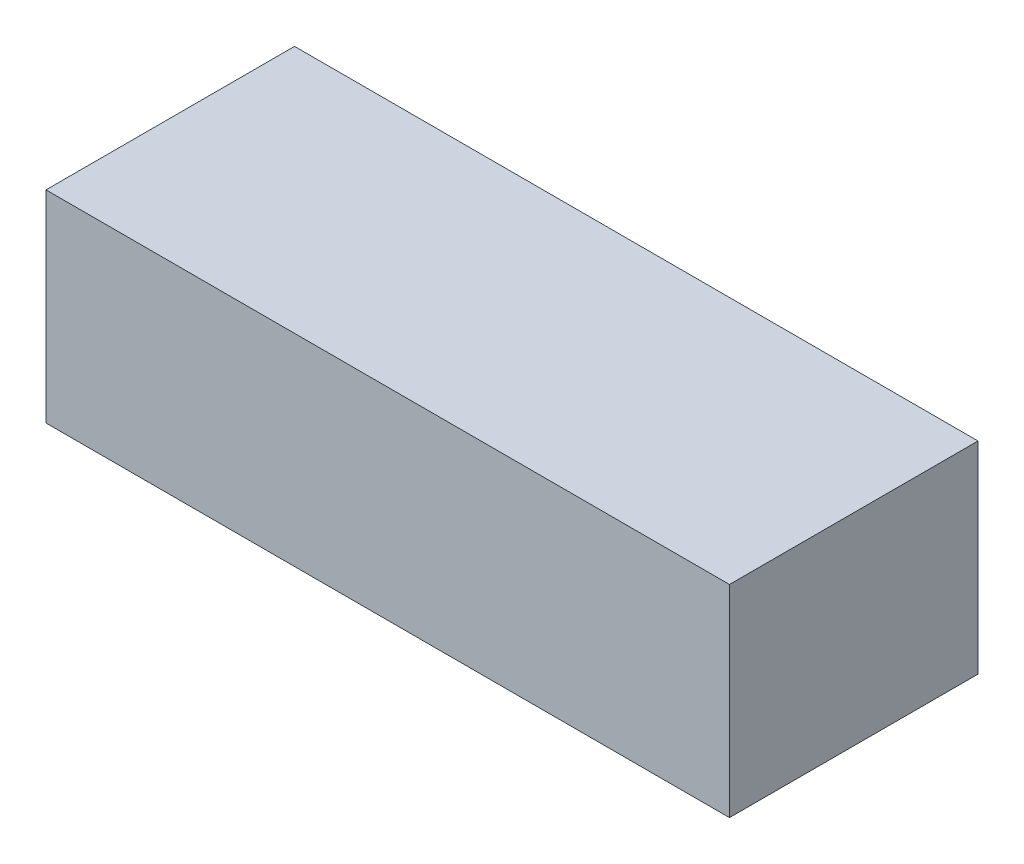
ISO-10303-21;
HEADER;
FILE_DESCRIPTION(('STEP AP214'),'2;1');
FILE_NAME('part.step','',(''),(''),'','','');
FILE_SCHEMA(('AUTOMOTIVE_DESIGN { 1 0 10303 214 1 1 1 1 }'));
ENDSEC;
DATA;
#1=APPLICATION_CONTEXT('core data for automotive mechanical design processes');
#2=APPLICATION_PROTOCOL_DEFINITION('international standard','automotive_design',2000,#1);
#3=PRODUCT_CONTEXT('',#1,'mechanical');
#4=PRODUCT('Part','Part','',(#3));
#5=PRODUCT_RELATED_PRODUCT_CATEGORY('part','',(#4));
#6=PRODUCT_DEFINITION_FORMATION('','',#4);
#7=PRODUCT_DEFINITION_CONTEXT('part definition',#1,'design');
#8=PRODUCT_DEFINITION('design','',#6,#7);
#9=PRODUCT_DEFINITION_SHAPE('','',#8);
#10=(LENGTH_UNIT() NAMED_UNIT(*) SI_UNIT(.MILLI.,.METRE.));
#11=(NAMED_UNIT(*) PLANE_ANGLE_UNIT() SI_UNIT($,.RADIAN.));
#12=(NAMED_UNIT(*) SI_UNIT($,.STERADIAN.) SOLID_ANGLE_UNIT());
#13=UNCERTAINTY_MEASURE_WITH_UNIT(LENGTH_MEASURE(1.E-05),#10,'distance_accuracy_value','');
#14=(GEOMETRIC_REPRESENTATION_CONTEXT(3) GLOBAL_UNCERTAINTY_ASSIGNED_CONTEXT((#13)) GLOBAL_UNIT_ASSIGNED_CONTEXT((#10,
#11,#12)) REPRESENTATION_CONTEXT('',''));
#15=CARTESIAN_POINT('',(0.,0.,0.));
#16=DIRECTION('',(0.,0.,1.));
#17=DIRECTION('',(1.,0.,0.));
#18=AXIS2_PLACEMENT_3D('',#15,#16,#17);
#19=CARTESIAN_POINT('',(20.,-12.,6.));
#20=DIRECTION('',(-1.,0.,0.));
#21=DIRECTION('',(0.,0.,1.));
#22=AXIS2_PLACEMENT_3D('',#19,#20,#21);
#23=PLANE('',#22);
#24=DIRECTION('',(0.,1.,0.));
#25=VECTOR('',#24,1.);
#26=CARTESIAN_POINT('',(20.,-12.,-6.));
#27=LINE('',#26,#25);
#28=CARTESIAN_POINT('',(20.,-7.,-6.));
#29=VERTEX_POINT('',#28);
#30=CARTESIAN_POINT('',(20.,-2.,-6.));
#31=VERTEX_POINT('',#30);
#32=EDGE_CURVE('E231',#29,#31,#27,.T.);
#33=ORIENTED_EDGE('',*,*,#32,.F.);
#34=DIRECTION('',(0.,0.,-1.));
#35=VECTOR('',#34,1.);
#36=CARTESIAN_POINT('',(20.,-7.,6.));
#37=LINE('',#36,#35);
#38=CARTESIAN_POINT('',(20.,-7.,6.));
#39=VERTEX_POINT('',#38);
#40=EDGE_CURVE('E238',#39,#29,#37,.T.);
#41=ORIENTED_EDGE('',*,*,#40,.F.);
#42=DIRECTION('',(0.,1.,0.));
#43=VECTOR('',#42,1.);
#44=CARTESIAN_POINT('',(20.,-12.,6.));
#45=LINE('',#44,#43);
#46=CARTESIAN_POINT('',(20.,-2.,6.));
#47=VERTEX_POINT('',#46);
#48=EDGE_CURVE('E251',#39,#47,#45,.T.);
#49=ORIENTED_EDGE('',*,*,#48,.T.);
#50=DIRECTION('',(0.,0.,1.));
#51=VECTOR('',#50,1.);
#52=CARTESIAN_POINT('',(20.,-2.,6.));
#53=LINE('',#52,#51);
#54=EDGE_CURVE('E249',#31,#47,#53,.T.);
#55=ORIENTED_EDGE('',*,*,#54,.F.);
#56=EDGE_LOOP('',(#33,#41,#49,#55));
#57=FACE_BOUND('',#56,.T.);
#58=ADVANCED_FACE('F39',(#57),#23,.T.);
#59=CARTESIAN_POINT('',(0.,-12.,0.));
#60=DIRECTION('',(0.,-1.,0.));
#61=DIRECTION('',(0.,0.,-1.));
#62=AXIS2_PLACEMENT_3D('',#59,#60,#61);
#63=PLANE('',#62);
#64=DIRECTION('',(-1.,0.,0.));
#65=VECTOR('',#64,1.);
#66=CARTESIAN_POINT('',(-20.,-12.,6.));
#67=LINE('',#66,#65);
#68=CARTESIAN_POINT('',(21.,-12.,6.));
#69=VERTEX_POINT('',#68);
#70=CARTESIAN_POINT('',(-20.,-12.,6.));
#71=VERTEX_POINT('',#70);
#72=EDGE_CURVE('E417',#69,#71,#67,.T.);
#73=ORIENTED_EDGE('',*,*,#72,.F.);
#74=DIRECTION('',(0.,0.,1.));
#75=VECTOR('',#74,1.);
#76=CARTESIAN_POINT('',(21.,-12.,-7.));
#77=LINE('',#76,#75);
#78=CARTESIAN_POINT('',(21.,-12.,7.));
#79=VERTEX_POINT('',#78);
#80=EDGE_CURVE('E446',#69,#79,#77,.T.);
#81=ORIENTED_EDGE('',*,*,#80,.T.);
#82=DIRECTION('',(-1.,0.,0.));
#83=VECTOR('',#82,1.);
#84=CARTESIAN_POINT('',(21.,-12.,7.));
#85=LINE('',#84,#83);
#86=CARTESIAN_POINT('',(-21.,-12.,7.));
#87=VERTEX_POINT('',#86);
#88=EDGE_CURVE('E445',#79,#87,#85,.T.);
#89=ORIENTED_EDGE('',*,*,#88,.T.);
#90=DIRECTION('',(0.,0.,-1.));
#91=VECTOR('',#90,1.);
#92=CARTESIAN_POINT('',(-21.,-12.,-7.));
#93=LINE('',#92,#91);
#94=CARTESIAN_POINT('',(-21.,-12.,-7.));
#95=VERTEX_POINT('',#94);
#96=EDGE_CURVE('E473',#87,#95,#93,.T.);
#97=ORIENTED_EDGE('',*,*,#96,.T.);
#98=DIRECTION('',(1.,0.,0.));
#99=VECTOR('',#98,1.);
#100=CARTESIAN_POINT('',(21.,-12.,-7.));
#101=LINE('',#100,#99);
#102=CARTESIAN_POINT('',(21.,-12.,-7.));
#103=VERTEX_POINT('',#102);
#104=EDGE_CURVE('E442',#95,#103,#101,.T.);
#105=ORIENTED_EDGE('',*,*,#104,.T.);
#106=CARTESIAN_POINT('',(21.,-12.,-6.));
#107=VERTEX_POINT('',#106);
#108=EDGE_CURVE('E440',#103,#107,#77,.T.);
#109=ORIENTED_EDGE('',*,*,#108,.T.);
#110=DIRECTION('',(1.,0.,0.));
#111=VECTOR('',#110,1.);
#112=CARTESIAN_POINT('',(-20.,-12.,-6.));
#113=LINE('',#112,#111);
#114=CARTESIAN_POINT('',(-20.,-12.,-6.));
#115=VERTEX_POINT('',#114);
#116=EDGE_CURVE('E56',#115,#107,#113,.T.);
#117=ORIENTED_EDGE('',*,*,#116,.F.);
#118=DIRECTION('',(0.,0.,-1.));
#119=VECTOR('',#118,1.);
#120=CARTESIAN_POINT('',(-20.,-12.,6.));
#121=LINE('',#120,#119);
#122=EDGE_CURVE('E413',#71,#115,#121,.T.);
#123=ORIENTED_EDGE('',*,*,#122,.F.);
#124=EDGE_LOOP('',(#73,#81,#89,#97,#105,#109,#117,#123));
#125=FACE_BOUND('',#124,.T.);
#126=ADVANCED_FACE('F436',(#125),#63,.T.);
#127=CARTESIAN_POINT('',(0.,-2.,0.));
#128=DIRECTION('',(0.,-1.,0.));
#129=DIRECTION('',(0.,0.,-1.));
#130=AXIS2_PLACEMENT_3D('',#127,#128,#129);
#131=PLANE('',#130);
#132=DIRECTION('',(1.,0.,0.));
#133=VECTOR('',#132,1.);
#134=CARTESIAN_POINT('',(-20.,-2.,-6.));
#135=LINE('',#134,#133);
#136=CARTESIAN_POINT('',(-18.3,-2.,-6.));
#137=VERTEX_POINT('',#136);
#138=CARTESIAN_POINT('',(-6.85,-2.,-6.00000000000006));
#139=VERTEX_POINT('',#138);
#140=EDGE_CURVE('E419',#137,#139,#135,.T.);
#141=ORIENTED_EDGE('',*,*,#140,.T.);
#142=DIRECTION('',(0.,0.,-1.));
#143=VECTOR('',#142,1.);
#144=CARTESIAN_POINT('',(-6.85,-2.,6.));
#145=LINE('',#144,#143);
#146=CARTESIAN_POINT('',(-6.85,-2.,6.));
#147=VERTEX_POINT('',#146);
#148=EDGE_CURVE('E320',#147,#139,#145,.T.);
#149=ORIENTED_EDGE('',*,*,#148,.F.);
#150=DIRECTION('',(-1.,0.,0.));
#151=VECTOR('',#150,1.);
#152=CARTESIAN_POINT('',(-20.,-2.,6.));
#153=LINE('',#152,#151);
#154=CARTESIAN_POINT('',(-18.3,-2.,6.));
#155=VERTEX_POINT('',#154);
#156=EDGE_CURVE('E424',#147,#155,#153,.T.);
#157=ORIENTED_EDGE('',*,*,#156,.T.);
#158=DIRECTION('',(0.,0.,-1.));
#159=VECTOR('',#158,1.);
#160=CARTESIAN_POINT('',(-18.3,-2.,6.));
#161=LINE('',#160,#159);
#162=EDGE_CURVE('E340',#155,#137,#161,.T.);
#163=ORIENTED_EDGE('',*,*,#162,.T.);
#164=EDGE_LOOP('',(#141,#149,#157,#163));
#165=FACE_BOUND('',#164,.T.);
#166=ADVANCED_FACE('F502',(#165),#131,.T.);
#167=CARTESIAN_POINT('',(-20.,-12.,6.));
#168=DIRECTION('',(1.,0.,0.));
#169=DIRECTION('',(0.,0.,-1.));
#170=AXIS2_PLACEMENT_3D('',#167,#168,#169);
#171=PLANE('',#170);
#172=DIRECTION('',(0.,0.,1.));
#173=VECTOR('',#172,1.);
#174=CARTESIAN_POINT('',(-20.,-11.,0.));
#175=LINE('',#174,#173);
#176=CARTESIAN_POINT('',(-20.,-11.,-5.49999999999999));
#177=VERTEX_POINT('',#176);
#178=CARTESIAN_POINT('',(-20.,-11.,5.50000000000001));
#179=VERTEX_POINT('',#178);
#180=EDGE_CURVE('E390',#177,#179,#175,.T.);
#181=ORIENTED_EDGE('',*,*,#180,.T.);
#182=DIRECTION('',(0.,-1.,0.));
#183=VECTOR('',#182,1.);
#184=CARTESIAN_POINT('',(-20.,0.,5.5));
#185=LINE('',#184,#183);
#186=CARTESIAN_POINT('',(-20.,-7.,5.50000000000001));
#187=VERTEX_POINT('',#186);
#188=EDGE_CURVE('E382',#187,#179,#185,.T.);
#189=ORIENTED_EDGE('',*,*,#188,.F.);
#190=DIRECTION('',(0.,0.,1.));
#191=VECTOR('',#190,1.);
#192=CARTESIAN_POINT('',(-20.,-7.,0.));
#193=LINE('',#192,#191);
#194=CARTESIAN_POINT('',(-20.,-7.,-5.5));
#195=VERTEX_POINT('',#194);
#196=EDGE_CURVE('E384',#195,#187,#193,.T.);
#197=ORIENTED_EDGE('',*,*,#196,.F.);
#198=DIRECTION('',(0.,-1.,0.));
#199=VECTOR('',#198,1.);
#200=CARTESIAN_POINT('',(-20.,0.,-5.5));
#201=LINE('',#200,#199);
#202=EDGE_CURVE('E387',#195,#177,#201,.T.);
#203=ORIENTED_EDGE('',*,*,#202,.T.);
#204=EDGE_LOOP('',(#181,#189,#197,#203));
#205=FACE_BOUND('',#204,.T.);
#206=DIRECTION('',(0.,1.,0.));
#207=VECTOR('',#206,1.);
#208=CARTESIAN_POINT('',(-20.,-12.,-6.));
#209=LINE('',#208,#207);
#210=CARTESIAN_POINT('',(-20.,-6.6,-6.));
#211=VERTEX_POINT('',#210);
#212=EDGE_CURVE('E250',#115,#211,#209,.T.);
#213=ORIENTED_EDGE('',*,*,#212,.T.);
#214=DIRECTION('',(0.,0.,-1.));
#215=VECTOR('',#214,1.);
#216=CARTESIAN_POINT('',(-20.,-6.6,6.));
#217=LINE('',#216,#215);
#218=CARTESIAN_POINT('',(-20.,-6.6,6.));
#219=VERTEX_POINT('',#218);
#220=EDGE_CURVE('E339',#219,#211,#217,.T.);
#221=ORIENTED_EDGE('',*,*,#220,.F.);
#222=DIRECTION('',(0.,1.,0.));
#223=VECTOR('',#222,1.);
#224=CARTESIAN_POINT('',(-20.,-12.,6.));
#225=LINE('',#224,#223);
#226=EDGE_CURVE('E256',#71,#219,#225,.T.);
#227=ORIENTED_EDGE('',*,*,#226,.F.);
#228=ORIENTED_EDGE('',*,*,#122,.T.);
#229=EDGE_LOOP('',(#213,#221,#227,#228));
#230=FACE_BOUND('',#229,.T.);
#231=ADVANCED_FACE('F434',(#205,#230),#171,.T.);
#232=CARTESIAN_POINT('',(-20.,-12.,-6.));
#233=DIRECTION('',(0.,0.,1.));
#234=DIRECTION('',(1.,0.,0.));
#235=AXIS2_PLACEMENT_3D('',#232,#233,#234);
#236=PLANE('',#235);
#237=DIRECTION('',(0.,1.,0.));
#238=VECTOR('',#237,1.);
#239=CARTESIAN_POINT('',(-5.15,-6.6,-6.00000000000005));
#240=LINE('',#239,#238);
#241=CARTESIAN_POINT('',(-5.15,-6.6,-6.00000000000005));
#242=VERTEX_POINT('',#241);
#243=CARTESIAN_POINT('',(-5.15,-2.,-6.00000000000005));
#244=VERTEX_POINT('',#243);
#245=EDGE_CURVE('E310',#242,#244,#240,.T.);
#246=ORIENTED_EDGE('',*,*,#245,.F.);
#247=DIRECTION('',(-1.,0.,0.));
#248=VECTOR('',#247,1.);
#249=CARTESIAN_POINT('',(-5.15,-6.6,-6.00000000000005));
#250=LINE('',#249,#248);
#251=CARTESIAN_POINT('',(-6.85,-6.6,-6.00000000000006));
#252=VERTEX_POINT('',#251);
#253=EDGE_CURVE('E330',#242,#252,#250,.T.);
#254=ORIENTED_EDGE('',*,*,#253,.T.);
#255=DIRECTION('',(0.,1.,0.));
#256=VECTOR('',#255,1.);
#257=CARTESIAN_POINT('',(-6.85,-6.6,-6.00000000000006));
#258=LINE('',#257,#256);
#259=EDGE_CURVE('E313',#252,#139,#258,.T.);
#260=ORIENTED_EDGE('',*,*,#259,.T.);
#261=ORIENTED_EDGE('',*,*,#140,.F.);
#262=DIRECTION('',(0.,1.,0.));
#263=VECTOR('',#262,1.);
#264=CARTESIAN_POINT('',(-18.3,-6.6,-6.));
#265=LINE('',#264,#263);
#266=CARTESIAN_POINT('',(-18.3,-6.6,-6.));
#267=VERTEX_POINT('',#266);
#268=EDGE_CURVE('E326',#267,#137,#265,.T.);
#269=ORIENTED_EDGE('',*,*,#268,.F.);
#270=DIRECTION('',(1.,0.,0.));
#271=VECTOR('',#270,1.);
#272=CARTESIAN_POINT('',(-20.,-6.6,-6.));
#273=LINE('',#272,#271);
#274=EDGE_CURVE('E344',#211,#267,#273,.T.);
#275=ORIENTED_EDGE('',*,*,#274,.F.);
#276=ORIENTED_EDGE('',*,*,#212,.F.);
#277=ORIENTED_EDGE('',*,*,#116,.T.);
#278=DIRECTION('',(0.,-1.,0.));
#279=VECTOR('',#278,1.);
#280=CARTESIAN_POINT('',(21.,-7.,-6.));
#281=LINE('',#280,#279);
#282=CARTESIAN_POINT('',(21.,-7.,-6.));
#283=VERTEX_POINT('',#282);
#284=EDGE_CURVE('E233',#283,#107,#281,.T.);
#285=ORIENTED_EDGE('',*,*,#284,.F.);
#286=DIRECTION('',(1.,0.,0.));
#287=VECTOR('',#286,1.);
#288=CARTESIAN_POINT('',(20.,-7.,-6.));
#289=LINE('',#288,#287);
#290=EDGE_CURVE('E225',#29,#283,#289,.T.);
#291=ORIENTED_EDGE('',*,*,#290,.F.);
#292=ORIENTED_EDGE('',*,*,#32,.T.);
#293=CARTESIAN_POINT('',(8.,-2.,-6.));
#294=VERTEX_POINT('',#293);
#295=EDGE_CURVE('E406',#294,#31,#135,.T.);
#296=ORIENTED_EDGE('',*,*,#295,.F.);
#297=DIRECTION('',(0.,1.,0.));
#298=VECTOR('',#297,1.);
#299=CARTESIAN_POINT('',(8.,-6.6,-6.));
#300=LINE('',#299,#298);
#301=CARTESIAN_POINT('',(8.,-6.6,-6.));
#302=VERTEX_POINT('',#301);
#303=EDGE_CURVE('E372',#302,#294,#300,.T.);
#304=ORIENTED_EDGE('',*,*,#303,.F.);
#305=DIRECTION('',(1.,0.,0.));
#306=VECTOR('',#305,1.);
#307=CARTESIAN_POINT('',(0.,-6.6,-6.));
#308=LINE('',#307,#306);
#309=CARTESIAN_POINT('',(6.3,-6.6,-6.));
#310=VERTEX_POINT('',#309);
#311=EDGE_CURVE('E360',#310,#302,#308,.T.);
#312=ORIENTED_EDGE('',*,*,#311,.F.);
#313=DIRECTION('',(0.,1.,0.));
#314=VECTOR('',#313,1.);
#315=CARTESIAN_POINT('',(6.3,-6.6,-6.));
#316=LINE('',#315,#314);
#317=CARTESIAN_POINT('',(6.3,-2.,-6.));
#318=VERTEX_POINT('',#317);
#319=EDGE_CURVE('E375',#310,#318,#316,.T.);
#320=ORIENTED_EDGE('',*,*,#319,.T.);
#321=EDGE_CURVE('E422',#244,#318,#135,.T.);
#322=ORIENTED_EDGE('',*,*,#321,.F.);
#323=EDGE_LOOP('',(#246,#254,#260,#261,#269,#275,#276,#277,#285,#291,#292,#296,#304,#312,#320,#322));
#324=FACE_BOUND('',#323,.T.);
#325=ADVANCED_FACE('F228',(#324),#236,.T.);
#326=CARTESIAN_POINT('',(-20.,-12.,6.));
#327=DIRECTION('',(0.,0.,-1.));
#328=DIRECTION('',(-1.,0.,0.));
#329=AXIS2_PLACEMENT_3D('',#326,#327,#328);
#330=PLANE('',#329);
#331=DIRECTION('',(0.,1.,0.));
#332=VECTOR('',#331,1.);
#333=CARTESIAN_POINT('',(-5.15,-6.6,6.));
#334=LINE('',#333,#332);
#335=CARTESIAN_POINT('',(-5.15,-6.6,6.));
#336=VERTEX_POINT('',#335);
#337=CARTESIAN_POINT('',(-5.15,-2.,6.));
#338=VERTEX_POINT('',#337);
#339=EDGE_CURVE('E309',#336,#338,#334,.T.);
#340=ORIENTED_EDGE('',*,*,#339,.T.);
#341=CARTESIAN_POINT('',(6.3,-2.,6.));
#342=VERTEX_POINT('',#341);
#343=EDGE_CURVE('E425',#342,#338,#153,.T.);
#344=ORIENTED_EDGE('',*,*,#343,.F.);
#345=DIRECTION('',(0.,1.,0.));
#346=VECTOR('',#345,1.);
#347=CARTESIAN_POINT('',(6.3,-6.6,6.));
#348=LINE('',#347,#346);
#349=CARTESIAN_POINT('',(6.3,-6.6,6.));
#350=VERTEX_POINT('',#349);
#351=EDGE_CURVE('E378',#350,#342,#348,.T.);
#352=ORIENTED_EDGE('',*,*,#351,.F.);
#353=DIRECTION('',(-1.,0.,0.));
#354=VECTOR('',#353,1.);
#355=CARTESIAN_POINT('',(0.,-6.6,6.));
#356=LINE('',#355,#354);
#357=CARTESIAN_POINT('',(8.,-6.6,6.));
#358=VERTEX_POINT('',#357);
#359=EDGE_CURVE('E353',#358,#350,#356,.T.);
#360=ORIENTED_EDGE('',*,*,#359,.F.);
#361=DIRECTION('',(0.,1.,0.));
#362=VECTOR('',#361,1.);
#363=CARTESIAN_POINT('',(8.,-6.6,6.));
#364=LINE('',#363,#362);
#365=CARTESIAN_POINT('',(8.,-2.,6.));
#366=VERTEX_POINT('',#365);
#367=EDGE_CURVE('E366',#358,#366,#364,.T.);
#368=ORIENTED_EDGE('',*,*,#367,.T.);
#369=EDGE_CURVE('E415',#47,#366,#153,.T.);
#370=ORIENTED_EDGE('',*,*,#369,.F.);
#371=ORIENTED_EDGE('',*,*,#48,.F.);
#372=DIRECTION('',(-1.,0.,0.));
#373=VECTOR('',#372,1.);
#374=CARTESIAN_POINT('',(20.,-7.,6.));
#375=LINE('',#374,#373);
#376=CARTESIAN_POINT('',(21.,-7.,6.));
#377=VERTEX_POINT('',#376);
#378=EDGE_CURVE('E243',#377,#39,#375,.T.);
#379=ORIENTED_EDGE('',*,*,#378,.F.);
#380=DIRECTION('',(0.,-1.,0.));
#381=VECTOR('',#380,1.);
#382=CARTESIAN_POINT('',(21.,-7.,6.));
#383=LINE('',#382,#381);
#384=EDGE_CURVE('E474',#377,#69,#383,.T.);
#385=ORIENTED_EDGE('',*,*,#384,.T.);
#386=ORIENTED_EDGE('',*,*,#72,.T.);
#387=ORIENTED_EDGE('',*,*,#226,.T.);
#388=DIRECTION('',(1.,0.,0.));
#389=VECTOR('',#388,1.);
#390=CARTESIAN_POINT('',(-20.,-6.6,6.));
#391=LINE('',#390,#389);
#392=CARTESIAN_POINT('',(-18.3,-6.6,6.));
#393=VERTEX_POINT('',#392);
#394=EDGE_CURVE('E346',#219,#393,#391,.T.);
#395=ORIENTED_EDGE('',*,*,#394,.T.);
#396=DIRECTION('',(0.,1.,0.));
#397=VECTOR('',#396,1.);
#398=CARTESIAN_POINT('',(-18.3,-6.6,6.));
#399=LINE('',#398,#397);
#400=EDGE_CURVE('E336',#393,#155,#399,.T.);
#401=ORIENTED_EDGE('',*,*,#400,.T.);
#402=ORIENTED_EDGE('',*,*,#156,.F.);
#403=DIRECTION('',(0.,1.,0.));
#404=VECTOR('',#403,1.);
#405=CARTESIAN_POINT('',(-6.85,-6.6,6.));
#406=LINE('',#405,#404);
#407=CARTESIAN_POINT('',(-6.85,-6.6,6.));
#408=VERTEX_POINT('',#407);
#409=EDGE_CURVE('E316',#408,#147,#406,.T.);
#410=ORIENTED_EDGE('',*,*,#409,.F.);
#411=DIRECTION('',(-1.,0.,0.));
#412=VECTOR('',#411,1.);
#413=CARTESIAN_POINT('',(-5.15,-6.6,6.));
#414=LINE('',#413,#412);
#415=EDGE_CURVE('E312',#336,#408,#414,.T.);
#416=ORIENTED_EDGE('',*,*,#415,.F.);
#417=EDGE_LOOP('',(#340,#344,#352,#360,#368,#370,#371,#379,#385,#386,#387,#395,#401,#402,#410,#416));
#418=FACE_BOUND('',#417,.T.);
#419=ADVANCED_FACE('F429',(#418),#330,.T.);
#420=DIRECTION('',(0.,0.,-1.));
#421=VECTOR('',#420,1.);
#422=CARTESIAN_POINT('',(-5.15,-2.,6.));
#423=LINE('',#422,#421);
#424=EDGE_CURVE('E322',#338,#244,#423,.T.);
#425=ORIENTED_EDGE('',*,*,#424,.T.);
#426=ORIENTED_EDGE('',*,*,#321,.T.);
#427=DIRECTION('',(0.,0.,-1.));
#428=VECTOR('',#427,1.);
#429=CARTESIAN_POINT('',(6.3,-2.,0.));
#430=LINE('',#429,#428);
#431=EDGE_CURVE('E343',#342,#318,#430,.T.);
#432=ORIENTED_EDGE('',*,*,#431,.F.);
#433=ORIENTED_EDGE('',*,*,#343,.T.);
#434=EDGE_LOOP('',(#425,#426,#432,#433));
#435=FACE_BOUND('',#434,.T.);
#436=ADVANCED_FACE('F489',(#435),#131,.T.);
#437=CARTESIAN_POINT('',(-22.,-2.,-8.));
#438=DIRECTION('',(-1.,0.,0.));
#439=DIRECTION('',(0.,0.,1.));
#440=AXIS2_PLACEMENT_3D('',#437,#438,#439);
#441=PLANE('',#440);
#442=DIRECTION('',(0.,0.,1.));
#443=VECTOR('',#442,1.);
#444=CARTESIAN_POINT('',(-22.,0.,-8.));
#445=LINE('',#444,#443);
#446=CARTESIAN_POINT('',(-22.,0.,-8.));
#447=VERTEX_POINT('',#446);
#448=CARTESIAN_POINT('',(-22.,0.,8.));
#449=VERTEX_POINT('',#448);
#450=EDGE_CURVE('E267',#447,#449,#445,.T.);
#451=ORIENTED_EDGE('',*,*,#450,.F.);
#452=DIRECTION('',(0.,1.,0.));
#453=VECTOR('',#452,1.);
#454=CARTESIAN_POINT('',(-22.,-2.,-8.));
#455=LINE('',#454,#453);
#456=CARTESIAN_POINT('',(-22.,-13.,-8.));
#457=VERTEX_POINT('',#456);
#458=EDGE_CURVE('E48',#457,#447,#455,.T.);
#459=ORIENTED_EDGE('',*,*,#458,.F.);
#460=DIRECTION('',(0.,0.,-1.));
#461=VECTOR('',#460,1.);
#462=CARTESIAN_POINT('',(-22.,-13.,8.));
#463=LINE('',#462,#461);
#464=CARTESIAN_POINT('',(-22.,-13.,8.));
#465=VERTEX_POINT('',#464);
#466=EDGE_CURVE('E291',#465,#457,#463,.T.);
#467=ORIENTED_EDGE('',*,*,#466,.F.);
#468=DIRECTION('',(0.,1.,0.));
#469=VECTOR('',#468,1.);
#470=CARTESIAN_POINT('',(-22.,-2.,8.));
#471=LINE('',#470,#469);
#472=EDGE_CURVE('E11',#465,#449,#471,.T.);
#473=ORIENTED_EDGE('',*,*,#472,.T.);
#474=EDGE_LOOP('',(#451,#459,#467,#473));
#475=FACE_BOUND('',#474,.T.);
#476=DIRECTION('',(0.,0.,1.));
#477=VECTOR('',#476,1.);
#478=CARTESIAN_POINT('',(-22.,-7.,0.));
#479=LINE('',#478,#477);
#480=CARTESIAN_POINT('',(-22.,-7.,-5.5));
#481=VERTEX_POINT('',#480);
#482=CARTESIAN_POINT('',(-22.,-7.,5.50000000000001));
#483=VERTEX_POINT('',#482);
#484=EDGE_CURVE('E396',#481,#483,#479,.T.);
#485=ORIENTED_EDGE('',*,*,#484,.T.);
#486=DIRECTION('',(0.,-1.,0.));
#487=VECTOR('',#486,1.);
#488=CARTESIAN_POINT('',(-22.,0.,5.5));
#489=LINE('',#488,#487);
#490=CARTESIAN_POINT('',(-22.,-11.,5.50000000000001));
#491=VERTEX_POINT('',#490);
#492=EDGE_CURVE('E381',#483,#491,#489,.T.);
#493=ORIENTED_EDGE('',*,*,#492,.T.);
#494=DIRECTION('',(0.,0.,1.));
#495=VECTOR('',#494,1.);
#496=CARTESIAN_POINT('',(-22.,-11.,0.));
#497=LINE('',#496,#495);
#498=CARTESIAN_POINT('',(-22.,-11.,-5.49999999999999));
#499=VERTEX_POINT('',#498);
#500=EDGE_CURVE('E385',#499,#491,#497,.T.);
#501=ORIENTED_EDGE('',*,*,#500,.F.);
#502=DIRECTION('',(0.,-1.,0.));
#503=VECTOR('',#502,1.);
#504=CARTESIAN_POINT('',(-22.,0.,-5.5));
#505=LINE('',#504,#503);
#506=EDGE_CURVE('E399',#481,#499,#505,.T.);
#507=ORIENTED_EDGE('',*,*,#506,.F.);
#508=EDGE_LOOP('',(#485,#493,#501,#507));
#509=FACE_BOUND('',#508,.T.);
#510=ADVANCED_FACE('F287',(#475,#509),#441,.T.);
#511=CARTESIAN_POINT('',(-22.,-2.,8.));
#512=DIRECTION('',(0.,0.,1.));
#513=DIRECTION('',(1.,0.,0.));
#514=AXIS2_PLACEMENT_3D('',#511,#512,#513);
#515=PLANE('',#514);
#516=DIRECTION('',(1.,0.,0.));
#517=VECTOR('',#516,1.);
#518=CARTESIAN_POINT('',(-22.,0.,8.));
#519=LINE('',#518,#517);
#520=CARTESIAN_POINT('',(22.,0.,8.));
#521=VERTEX_POINT('',#520);
#522=EDGE_CURVE('E254',#449,#521,#519,.T.);
#523=ORIENTED_EDGE('',*,*,#522,.F.);
#524=ORIENTED_EDGE('',*,*,#472,.F.);
#525=DIRECTION('',(-1.,0.,0.));
#526=VECTOR('',#525,1.);
#527=CARTESIAN_POINT('',(22.,-13.,8.));
#528=LINE('',#527,#526);
#529=CARTESIAN_POINT('',(22.,-13.,8.));
#530=VERTEX_POINT('',#529);
#531=EDGE_CURVE('E279',#530,#465,#528,.T.);
#532=ORIENTED_EDGE('',*,*,#531,.F.);
#533=DIRECTION('',(0.,1.,0.));
#534=VECTOR('',#533,1.);
#535=CARTESIAN_POINT('',(22.,-2.,8.));
#536=LINE('',#535,#534);
#537=EDGE_CURVE('E43',#530,#521,#536,.T.);
#538=ORIENTED_EDGE('',*,*,#537,.T.);
#539=EDGE_LOOP('',(#523,#524,#532,#538));
#540=FACE_BOUND('',#539,.T.);
#541=ADVANCED_FACE('F41',(#540),#515,.T.);
#542=CARTESIAN_POINT('',(-22.,-2.,-8.));
#543=DIRECTION('',(0.,0.,1.));
#544=DIRECTION('',(1.,0.,0.));
#545=AXIS2_PLACEMENT_3D('',#542,#543,#544);
#546=PLANE('',#545);
#547=DIRECTION('',(1.,0.,0.));
#548=VECTOR('',#547,1.);
#549=CARTESIAN_POINT('',(-22.,0.,-8.));
#550=LINE('',#549,#548);
#551=CARTESIAN_POINT('',(22.,0.,-8.));
#552=VERTEX_POINT('',#551);
#553=EDGE_CURVE('E265',#447,#552,#550,.T.);
#554=ORIENTED_EDGE('',*,*,#553,.T.);
#555=DIRECTION('',(0.,1.,0.));
#556=VECTOR('',#555,1.);
#557=CARTESIAN_POINT('',(22.,-2.,-8.));
#558=LINE('',#557,#556);
#559=CARTESIAN_POINT('',(22.,-13.,-8.));
#560=VERTEX_POINT('',#559);
#561=EDGE_CURVE('E270',#560,#552,#558,.T.);
#562=ORIENTED_EDGE('',*,*,#561,.F.);
#563=DIRECTION('',(1.,0.,0.));
#564=VECTOR('',#563,1.);
#565=CARTESIAN_POINT('',(-22.,-13.,-8.));
#566=LINE('',#565,#564);
#567=EDGE_CURVE('E295',#457,#560,#566,.T.);
#568=ORIENTED_EDGE('',*,*,#567,.F.);
#569=ORIENTED_EDGE('',*,*,#458,.T.);
#570=EDGE_LOOP('',(#554,#562,#568,#569));
#571=FACE_BOUND('',#570,.T.);
#572=ADVANCED_FACE('F551',(#571),#546,.F.);
#573=CARTESIAN_POINT('',(22.,-2.,-8.));
#574=DIRECTION('',(-1.,0.,0.));
#575=DIRECTION('',(0.,0.,1.));
#576=AXIS2_PLACEMENT_3D('',#573,#574,#575);
#577=PLANE('',#576);
#578=DIRECTION('',(0.,0.,1.));
#579=VECTOR('',#578,1.);
#580=CARTESIAN_POINT('',(22.,0.,-8.));
#581=LINE('',#580,#579);
#582=EDGE_CURVE('E262',#552,#521,#581,.T.);
#583=ORIENTED_EDGE('',*,*,#582,.T.);
#584=ORIENTED_EDGE('',*,*,#537,.F.);
#585=DIRECTION('',(0.,0.,1.));
#586=VECTOR('',#585,1.);
#587=CARTESIAN_POINT('',(22.,-13.,-8.));
#588=LINE('',#587,#586);
#589=EDGE_CURVE('E299',#560,#530,#588,.T.);
#590=ORIENTED_EDGE('',*,*,#589,.F.);
#591=ORIENTED_EDGE('',*,*,#561,.T.);
#592=EDGE_LOOP('',(#583,#584,#590,#591));
#593=FACE_BOUND('',#592,.T.);
#594=ADVANCED_FACE('F281',(#593),#577,.F.);
#595=CARTESIAN_POINT('',(0.,0.,0.));
#596=DIRECTION('',(0.,-1.,0.));
#597=DIRECTION('',(0.,0.,-1.));
#598=AXIS2_PLACEMENT_3D('',#595,#596,#597);
#599=PLANE('',#598);
#600=ORIENTED_EDGE('',*,*,#522,.T.);
#601=ORIENTED_EDGE('',*,*,#582,.F.);
#602=ORIENTED_EDGE('',*,*,#553,.F.);
#603=ORIENTED_EDGE('',*,*,#450,.T.);
#604=EDGE_LOOP('',(#600,#601,#602,#603));
#605=FACE_BOUND('',#604,.T.);
#606=ADVANCED_FACE('F284',(#605),#599,.F.);
#607=DIRECTION('',(0.,0.,-1.));
#608=VECTOR('',#607,1.);
#609=CARTESIAN_POINT('',(8.,-2.,0.));
#610=LINE('',#609,#608);
#611=EDGE_CURVE('E357',#366,#294,#610,.T.);
#612=ORIENTED_EDGE('',*,*,#611,.T.);
#613=ORIENTED_EDGE('',*,*,#295,.T.);
#614=ORIENTED_EDGE('',*,*,#54,.T.);
#615=ORIENTED_EDGE('',*,*,#369,.T.);
#616=EDGE_LOOP('',(#612,#613,#614,#615));
#617=FACE_BOUND('',#616,.T.);
#618=ADVANCED_FACE('F485',(#617),#131,.T.);
#619=CARTESIAN_POINT('',(-20.,0.,5.5));
#620=DIRECTION('',(0.,0.,-1.));
#621=DIRECTION('',(0.,1.,0.));
#622=AXIS2_PLACEMENT_3D('',#619,#620,#621);
#623=PLANE('',#622);
#624=ORIENTED_EDGE('',*,*,#492,.F.);
#625=DIRECTION('',(-1.,0.,0.));
#626=VECTOR('',#625,1.);
#627=CARTESIAN_POINT('',(-20.,-7.,5.50000000000001));
#628=LINE('',#627,#626);
#629=EDGE_CURVE('E393',#187,#483,#628,.T.);
#630=ORIENTED_EDGE('',*,*,#629,.F.);
#631=ORIENTED_EDGE('',*,*,#188,.T.);
#632=DIRECTION('',(-1.,0.,0.));
#633=VECTOR('',#632,1.);
#634=CARTESIAN_POINT('',(-20.,-11.,5.50000000000001));
#635=LINE('',#634,#633);
#636=EDGE_CURVE('E404',#179,#491,#635,.T.);
#637=ORIENTED_EDGE('',*,*,#636,.T.);
#638=EDGE_LOOP('',(#624,#630,#631,#637));
#639=FACE_BOUND('',#638,.T.);
#640=ADVANCED_FACE('F546',(#639),#623,.T.);
#641=CARTESIAN_POINT('',(-20.,-11.,0.));
#642=DIRECTION('',(0.,-1.,0.));
#643=DIRECTION('',(0.,0.,-1.));
#644=AXIS2_PLACEMENT_3D('',#641,#642,#643);
#645=PLANE('',#644);
#646=ORIENTED_EDGE('',*,*,#500,.T.);
#647=ORIENTED_EDGE('',*,*,#636,.F.);
#648=ORIENTED_EDGE('',*,*,#180,.F.);
#649=DIRECTION('',(-1.,0.,0.));
#650=VECTOR('',#649,1.);
#651=CARTESIAN_POINT('',(-20.,-11.,-5.49999999999999));
#652=LINE('',#651,#650);
#653=EDGE_CURVE('E407',#177,#499,#652,.T.);
#654=ORIENTED_EDGE('',*,*,#653,.T.);
#655=EDGE_LOOP('',(#646,#647,#648,#654));
#656=FACE_BOUND('',#655,.T.);
#657=ADVANCED_FACE('F577',(#656),#645,.F.);
#658=CARTESIAN_POINT('',(-20.,0.,-5.5));
#659=DIRECTION('',(0.,0.,-1.));
#660=DIRECTION('',(0.,1.,0.));
#661=AXIS2_PLACEMENT_3D('',#658,#659,#660);
#662=PLANE('',#661);
#663=ORIENTED_EDGE('',*,*,#506,.T.);
#664=ORIENTED_EDGE('',*,*,#653,.F.);
#665=ORIENTED_EDGE('',*,*,#202,.F.);
#666=DIRECTION('',(-1.,0.,0.));
#667=VECTOR('',#666,1.);
#668=CARTESIAN_POINT('',(-20.,-7.,-5.5));
#669=LINE('',#668,#667);
#670=EDGE_CURVE('E409',#195,#481,#669,.T.);
#671=ORIENTED_EDGE('',*,*,#670,.T.);
#672=EDGE_LOOP('',(#663,#664,#665,#671));
#673=FACE_BOUND('',#672,.T.);
#674=ADVANCED_FACE('F584',(#673),#662,.F.);
#675=CARTESIAN_POINT('',(-20.,-7.,0.));
#676=DIRECTION('',(0.,-1.,0.));
#677=DIRECTION('',(0.,0.,-1.));
#678=AXIS2_PLACEMENT_3D('',#675,#676,#677);
#679=PLANE('',#678);
#680=ORIENTED_EDGE('',*,*,#484,.F.);
#681=ORIENTED_EDGE('',*,*,#670,.F.);
#682=ORIENTED_EDGE('',*,*,#196,.T.);
#683=ORIENTED_EDGE('',*,*,#629,.T.);
#684=EDGE_LOOP('',(#680,#681,#682,#683));
#685=FACE_BOUND('',#684,.T.);
#686=ADVANCED_FACE('F592',(#685),#679,.T.);
#687=CARTESIAN_POINT('',(6.3,-6.6,0.));
#688=DIRECTION('',(1.,0.,0.));
#689=DIRECTION('',(0.,0.,-1.));
#690=AXIS2_PLACEMENT_3D('',#687,#688,#689);
#691=PLANE('',#690);
#692=ORIENTED_EDGE('',*,*,#431,.T.);
#693=ORIENTED_EDGE('',*,*,#319,.F.);
#694=DIRECTION('',(0.,0.,-1.));
#695=VECTOR('',#694,1.);
#696=CARTESIAN_POINT('',(6.3,-6.6,0.));
#697=LINE('',#696,#695);
#698=EDGE_CURVE('E356',#350,#310,#697,.T.);
#699=ORIENTED_EDGE('',*,*,#698,.F.);
#700=ORIENTED_EDGE('',*,*,#351,.T.);
#701=EDGE_LOOP('',(#692,#693,#699,#700));
#702=FACE_BOUND('',#701,.T.);
#703=ADVANCED_FACE('F495',(#702),#691,.F.);
#704=CARTESIAN_POINT('',(8.,-6.6,0.));
#705=DIRECTION('',(1.,0.,0.));
#706=DIRECTION('',(0.,0.,-1.));
#707=AXIS2_PLACEMENT_3D('',#704,#705,#706);
#708=PLANE('',#707);
#709=ORIENTED_EDGE('',*,*,#611,.F.);
#710=ORIENTED_EDGE('',*,*,#367,.F.);
#711=DIRECTION('',(0.,0.,-1.));
#712=VECTOR('',#711,1.);
#713=CARTESIAN_POINT('',(8.,-6.6,0.));
#714=LINE('',#713,#712);
#715=EDGE_CURVE('E363',#358,#302,#714,.T.);
#716=ORIENTED_EDGE('',*,*,#715,.T.);
#717=ORIENTED_EDGE('',*,*,#303,.T.);
#718=EDGE_LOOP('',(#709,#710,#716,#717));
#719=FACE_BOUND('',#718,.T.);
#720=ADVANCED_FACE('F607',(#719),#708,.T.);
#721=CARTESIAN_POINT('',(0.,-6.6,0.));
#722=DIRECTION('',(0.,-1.,0.));
#723=DIRECTION('',(0.,0.,-1.));
#724=AXIS2_PLACEMENT_3D('',#721,#722,#723);
#725=PLANE('',#724);
#726=ORIENTED_EDGE('',*,*,#359,.T.);
#727=ORIENTED_EDGE('',*,*,#698,.T.);
#728=ORIENTED_EDGE('',*,*,#311,.T.);
#729=ORIENTED_EDGE('',*,*,#715,.F.);
#730=EDGE_LOOP('',(#726,#727,#728,#729));
#731=FACE_BOUND('',#730,.T.);
#732=ADVANCED_FACE('F614',(#731),#725,.T.);
#733=CARTESIAN_POINT('',(-18.3,-6.6,6.));
#734=DIRECTION('',(1.,0.,0.));
#735=DIRECTION('',(0.,0.,-1.));
#736=AXIS2_PLACEMENT_3D('',#733,#734,#735);
#737=PLANE('',#736);
#738=ORIENTED_EDGE('',*,*,#162,.F.);
#739=ORIENTED_EDGE('',*,*,#400,.F.);
#740=DIRECTION('',(0.,0.,-1.));
#741=VECTOR('',#740,1.);
#742=CARTESIAN_POINT('',(-18.3,-6.6,6.));
#743=LINE('',#742,#741);
#744=EDGE_CURVE('E349',#393,#267,#743,.T.);
#745=ORIENTED_EDGE('',*,*,#744,.T.);
#746=ORIENTED_EDGE('',*,*,#268,.T.);
#747=EDGE_LOOP('',(#738,#739,#745,#746));
#748=FACE_BOUND('',#747,.T.);
#749=ADVANCED_FACE('F506',(#748),#737,.T.);
#750=CARTESIAN_POINT('',(0.,-6.6,0.));
#751=DIRECTION('',(0.,1.,0.));
#752=DIRECTION('',(0.,0.,1.));
#753=AXIS2_PLACEMENT_3D('',#750,#751,#752);
#754=PLANE('',#753);
#755=ORIENTED_EDGE('',*,*,#274,.T.);
#756=ORIENTED_EDGE('',*,*,#744,.F.);
#757=ORIENTED_EDGE('',*,*,#394,.F.);
#758=ORIENTED_EDGE('',*,*,#220,.T.);
#759=EDGE_LOOP('',(#755,#756,#757,#758));
#760=FACE_BOUND('',#759,.T.);
#761=ADVANCED_FACE('F520',(#760),#754,.F.);
#762=CARTESIAN_POINT('',(-5.15,-6.6,6.));
#763=DIRECTION('',(1.,0.,0.));
#764=DIRECTION('',(0.,0.,-1.));
#765=AXIS2_PLACEMENT_3D('',#762,#763,#764);
#766=PLANE('',#765);
#767=ORIENTED_EDGE('',*,*,#424,.F.);
#768=ORIENTED_EDGE('',*,*,#339,.F.);
#769=DIRECTION('',(0.,0.,-1.));
#770=VECTOR('',#769,1.);
#771=CARTESIAN_POINT('',(-5.15,-6.6,6.));
#772=LINE('',#771,#770);
#773=EDGE_CURVE('E323',#336,#242,#772,.T.);
#774=ORIENTED_EDGE('',*,*,#773,.T.);
#775=ORIENTED_EDGE('',*,*,#245,.T.);
#776=EDGE_LOOP('',(#767,#768,#774,#775));
#777=FACE_BOUND('',#776,.T.);
#778=ADVANCED_FACE('F518',(#777),#766,.T.);
#779=CARTESIAN_POINT('',(-6.85,-6.6,6.));
#780=DIRECTION('',(1.,0.,0.));
#781=DIRECTION('',(0.,0.,-1.));
#782=AXIS2_PLACEMENT_3D('',#779,#780,#781);
#783=PLANE('',#782);
#784=ORIENTED_EDGE('',*,*,#148,.T.);
#785=ORIENTED_EDGE('',*,*,#259,.F.);
#786=DIRECTION('',(0.,0.,-1.));
#787=VECTOR('',#786,1.);
#788=CARTESIAN_POINT('',(-6.85,-6.6,6.));
#789=LINE('',#788,#787);
#790=EDGE_CURVE('E328',#408,#252,#789,.T.);
#791=ORIENTED_EDGE('',*,*,#790,.F.);
#792=ORIENTED_EDGE('',*,*,#409,.T.);
#793=EDGE_LOOP('',(#784,#785,#791,#792));
#794=FACE_BOUND('',#793,.T.);
#795=ADVANCED_FACE('F513',(#794),#783,.F.);
#796=CARTESIAN_POINT('',(0.,-6.6,0.));
#797=DIRECTION('',(0.,1.,0.));
#798=DIRECTION('',(0.,0.,1.));
#799=AXIS2_PLACEMENT_3D('',#796,#797,#798);
#800=PLANE('',#799);
#801=ORIENTED_EDGE('',*,*,#773,.F.);
#802=ORIENTED_EDGE('',*,*,#415,.T.);
#803=ORIENTED_EDGE('',*,*,#790,.T.);
#804=ORIENTED_EDGE('',*,*,#253,.F.);
#805=EDGE_LOOP('',(#801,#802,#803,#804));
#806=FACE_BOUND('',#805,.T.);
#807=ADVANCED_FACE('F516',(#806),#800,.F.);
#808=CARTESIAN_POINT('',(0.,-13.,0.));
#809=DIRECTION('',(0.,-1.,0.));
#810=DIRECTION('',(0.,0.,-1.));
#811=AXIS2_PLACEMENT_3D('',#808,#809,#810);
#812=PLANE('',#811);
#813=ORIENTED_EDGE('',*,*,#531,.T.);
#814=ORIENTED_EDGE('',*,*,#466,.T.);
#815=ORIENTED_EDGE('',*,*,#567,.T.);
#816=ORIENTED_EDGE('',*,*,#589,.T.);
#817=EDGE_LOOP('',(#813,#814,#815,#816));
#818=FACE_BOUND('',#817,.T.);
#819=DIRECTION('',(1.,0.,0.));
#820=VECTOR('',#819,1.);
#821=CARTESIAN_POINT('',(21.,-13.,-7.));
#822=LINE('',#821,#820);
#823=CARTESIAN_POINT('',(-21.,-13.,-7.));
#824=VERTEX_POINT('',#823);
#825=CARTESIAN_POINT('',(21.,-13.,-7.));
#826=VERTEX_POINT('',#825);
#827=EDGE_CURVE('E462',#824,#826,#822,.T.);
#828=ORIENTED_EDGE('',*,*,#827,.F.);
#829=DIRECTION('',(0.,0.,-1.));
#830=VECTOR('',#829,1.);
#831=CARTESIAN_POINT('',(-21.,-13.,-7.));
#832=LINE('',#831,#830);
#833=CARTESIAN_POINT('',(-21.,-13.,7.));
#834=VERTEX_POINT('',#833);
#835=EDGE_CURVE('E449',#834,#824,#832,.T.);
#836=ORIENTED_EDGE('',*,*,#835,.F.);
#837=DIRECTION('',(-1.,0.,0.));
#838=VECTOR('',#837,1.);
#839=CARTESIAN_POINT('',(21.,-13.,7.));
#840=LINE('',#839,#838);
#841=CARTESIAN_POINT('',(21.,-13.,7.));
#842=VERTEX_POINT('',#841);
#843=EDGE_CURVE('E456',#842,#834,#840,.T.);
#844=ORIENTED_EDGE('',*,*,#843,.F.);
#845=DIRECTION('',(0.,0.,1.));
#846=VECTOR('',#845,1.);
#847=CARTESIAN_POINT('',(21.,-13.,-7.));
#848=LINE('',#847,#846);
#849=EDGE_CURVE('E466',#826,#842,#848,.T.);
#850=ORIENTED_EDGE('',*,*,#849,.F.);
#851=EDGE_LOOP('',(#828,#836,#844,#850));
#852=FACE_BOUND('',#851,.T.);
#853=ADVANCED_FACE('F297',(#818,#852),#812,.T.);
#854=CARTESIAN_POINT('',(-21.,-13.,-7.));
#855=DIRECTION('',(1.,0.,0.));
#856=DIRECTION('',(0.,0.,-1.));
#857=AXIS2_PLACEMENT_3D('',#854,#855,#856);
#858=PLANE('',#857);
#859=ORIENTED_EDGE('',*,*,#96,.F.);
#860=DIRECTION('',(0.,1.,0.));
#861=VECTOR('',#860,1.);
#862=CARTESIAN_POINT('',(-21.,-13.,7.));
#863=LINE('',#862,#861);
#864=EDGE_CURVE('E64',#834,#87,#863,.T.);
#865=ORIENTED_EDGE('',*,*,#864,.F.);
#866=ORIENTED_EDGE('',*,*,#835,.T.);
#867=DIRECTION('',(0.,1.,0.));
#868=VECTOR('',#867,1.);
#869=CARTESIAN_POINT('',(-21.,-13.,-7.));
#870=LINE('',#869,#868);
#871=EDGE_CURVE('E300',#824,#95,#870,.T.);
#872=ORIENTED_EDGE('',*,*,#871,.T.);
#873=EDGE_LOOP('',(#859,#865,#866,#872));
#874=FACE_BOUND('',#873,.T.);
#875=ADVANCED_FACE('F481',(#874),#858,.T.);
#876=CARTESIAN_POINT('',(21.,-13.,-7.));
#877=DIRECTION('',(0.,0.,1.));
#878=DIRECTION('',(1.,0.,0.));
#879=AXIS2_PLACEMENT_3D('',#876,#877,#878);
#880=PLANE('',#879);
#881=ORIENTED_EDGE('',*,*,#104,.F.);
#882=ORIENTED_EDGE('',*,*,#871,.F.);
#883=ORIENTED_EDGE('',*,*,#827,.T.);
#884=DIRECTION('',(0.,1.,0.));
#885=VECTOR('',#884,1.);
#886=CARTESIAN_POINT('',(21.,-13.,-7.));
#887=LINE('',#886,#885);
#888=EDGE_CURVE('E303',#826,#103,#887,.T.);
#889=ORIENTED_EDGE('',*,*,#888,.T.);
#890=EDGE_LOOP('',(#881,#882,#883,#889));
#891=FACE_BOUND('',#890,.T.);
#892=ADVANCED_FACE('F459',(#891),#880,.T.);
#893=CARTESIAN_POINT('',(21.,-13.,-7.));
#894=DIRECTION('',(-1.,0.,0.));
#895=DIRECTION('',(0.,0.,1.));
#896=AXIS2_PLACEMENT_3D('',#893,#894,#895);
#897=PLANE('',#896);
#898=ORIENTED_EDGE('',*,*,#108,.F.);
#899=ORIENTED_EDGE('',*,*,#888,.F.);
#900=ORIENTED_EDGE('',*,*,#849,.T.);
#901=DIRECTION('',(0.,1.,0.));
#902=VECTOR('',#901,1.);
#903=CARTESIAN_POINT('',(21.,-13.,7.));
#904=LINE('',#903,#902);
#905=EDGE_CURVE('E455',#842,#79,#904,.T.);
#906=ORIENTED_EDGE('',*,*,#905,.T.);
#907=ORIENTED_EDGE('',*,*,#80,.F.);
#908=ORIENTED_EDGE('',*,*,#384,.F.);
#909=DIRECTION('',(0.,0.,1.));
#910=VECTOR('',#909,1.);
#911=CARTESIAN_POINT('',(21.,-7.,6.));
#912=LINE('',#911,#910);
#913=EDGE_CURVE('E237',#283,#377,#912,.T.);
#914=ORIENTED_EDGE('',*,*,#913,.F.);
#915=ORIENTED_EDGE('',*,*,#284,.T.);
#916=EDGE_LOOP('',(#898,#899,#900,#906,#907,#908,#914,#915));
#917=FACE_BOUND('',#916,.T.);
#918=ADVANCED_FACE('F465',(#917),#897,.T.);
#919=CARTESIAN_POINT('',(21.,-13.,7.));
#920=DIRECTION('',(0.,0.,-1.));
#921=DIRECTION('',(-1.,0.,0.));
#922=AXIS2_PLACEMENT_3D('',#919,#920,#921);
#923=PLANE('',#922);
#924=ORIENTED_EDGE('',*,*,#88,.F.);
#925=ORIENTED_EDGE('',*,*,#905,.F.);
#926=ORIENTED_EDGE('',*,*,#843,.T.);
#927=ORIENTED_EDGE('',*,*,#864,.T.);
#928=EDGE_LOOP('',(#924,#925,#926,#927));
#929=FACE_BOUND('',#928,.T.);
#930=ADVANCED_FACE('F482',(#929),#923,.T.);
#931=CARTESIAN_POINT('',(0.,-7.,0.));
#932=DIRECTION('',(0.,-1.,0.));
#933=DIRECTION('',(0.,0.,-1.));
#934=AXIS2_PLACEMENT_3D('',#931,#932,#933);
#935=PLANE('',#934);
#936=ORIENTED_EDGE('',*,*,#40,.T.);
#937=ORIENTED_EDGE('',*,*,#290,.T.);
#938=ORIENTED_EDGE('',*,*,#913,.T.);
#939=ORIENTED_EDGE('',*,*,#378,.T.);
#940=EDGE_LOOP('',(#936,#937,#938,#939));
#941=FACE_BOUND('',#940,.T.);
#942=ADVANCED_FACE('F241',(#941),#935,.T.);
#943=CLOSED_SHELL('',(#58,#126,#166,#231,#325,#419,#436,#510,#541,#572,#594,#606,#618,#640,#657,
#674,#686,#703,#720,#732,#749,#761,#778,#795,#807,#853,#875,#892,#918,#930,#942));
#944=MANIFOLD_SOLID_BREP('B2',#943);
#945=ADVANCED_BREP_SHAPE_REPRESENTATION('',(#18,#944),#14);
#946=SHAPE_DEFINITION_REPRESENTATION(#9,#945);
ENDSEC;
END-ISO-10303-21;
